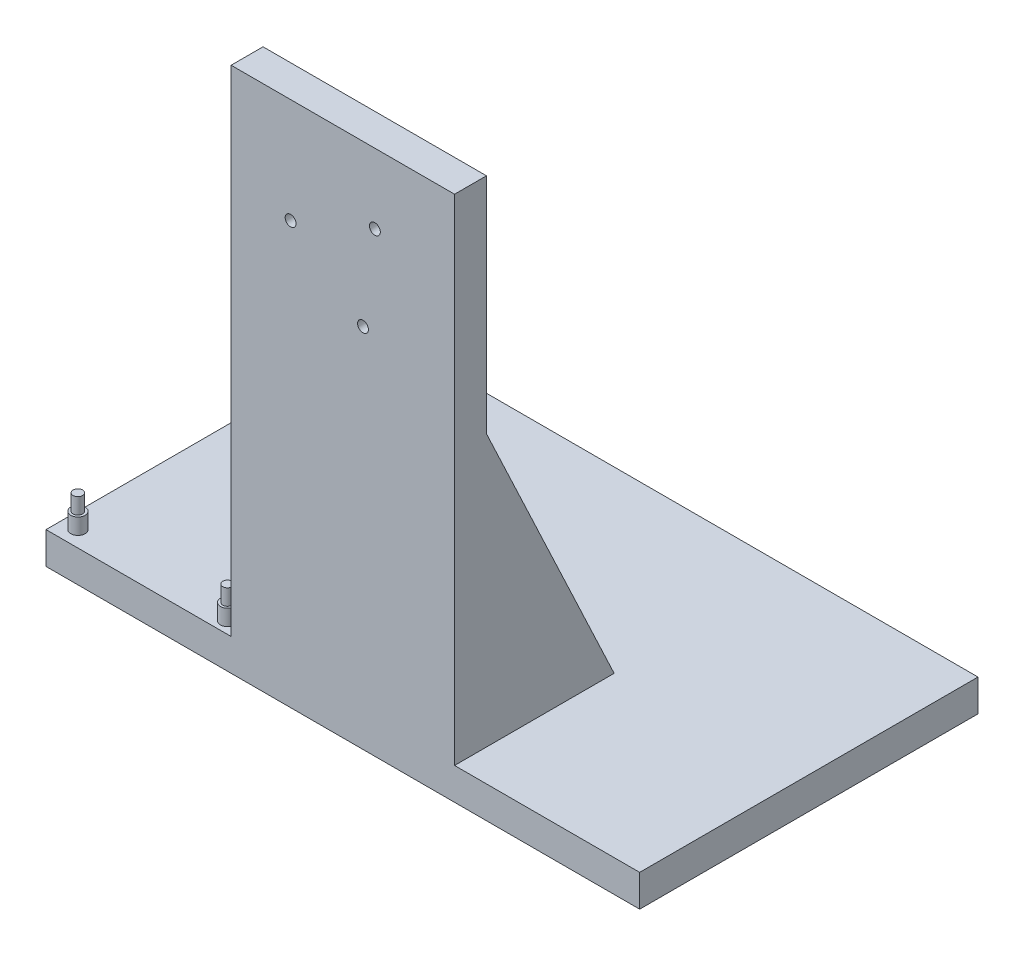
ISO-10303-21;
HEADER;
FILE_DESCRIPTION(('STEP AP214'),'2;1');
FILE_NAME('part.step','',(''),(''),'','','');
FILE_SCHEMA(('AUTOMOTIVE_DESIGN { 1 0 10303 214 1 1 1 1 }'));
ENDSEC;
DATA;
#1=APPLICATION_CONTEXT('core data for automotive mechanical design processes');
#2=APPLICATION_PROTOCOL_DEFINITION('international standard','automotive_design',2000,#1);
#3=PRODUCT_CONTEXT('',#1,'mechanical');
#4=PRODUCT('Part','Part','',(#3));
#5=PRODUCT_RELATED_PRODUCT_CATEGORY('part','',(#4));
#6=PRODUCT_DEFINITION_FORMATION('','',#4);
#7=PRODUCT_DEFINITION_CONTEXT('part definition',#1,'design');
#8=PRODUCT_DEFINITION('design','',#6,#7);
#9=PRODUCT_DEFINITION_SHAPE('','',#8);
#10=(LENGTH_UNIT() NAMED_UNIT(*) SI_UNIT(.MILLI.,.METRE.));
#11=(NAMED_UNIT(*) PLANE_ANGLE_UNIT() SI_UNIT($,.RADIAN.));
#12=(NAMED_UNIT(*) SI_UNIT($,.STERADIAN.) SOLID_ANGLE_UNIT());
#13=UNCERTAINTY_MEASURE_WITH_UNIT(LENGTH_MEASURE(1.E-05),#10,'distance_accuracy_value','');
#14=(GEOMETRIC_REPRESENTATION_CONTEXT(3) GLOBAL_UNCERTAINTY_ASSIGNED_CONTEXT((#13)) GLOBAL_UNIT_ASSIGNED_CONTEXT((#10,
#11,#12)) REPRESENTATION_CONTEXT('',''));
#15=CARTESIAN_POINT('',(0.,0.,0.));
#16=DIRECTION('',(0.,0.,1.));
#17=DIRECTION('',(1.,0.,0.));
#18=AXIS2_PLACEMENT_3D('',#15,#16,#17);
#19=CARTESIAN_POINT('',(35.,-35.,10.));
#20=DIRECTION('',(-1.,0.,0.));
#21=DIRECTION('',(0.,0.,1.));
#22=AXIS2_PLACEMENT_3D('',#19,#20,#21);
#23=PLANE('',#22);
#24=DIRECTION('',(0.,0.,1.));
#25=VECTOR('',#24,1.);
#26=CARTESIAN_POINT('',(35.,-120.,10.));
#27=LINE('',#26,#25);
#28=CARTESIAN_POINT('',(35.,-120.,-39.9999999999999));
#29=VERTEX_POINT('',#28);
#30=CARTESIAN_POINT('',(35.,-120.,10.));
#31=VERTEX_POINT('',#30);
#32=EDGE_CURVE('E67',#29,#31,#27,.T.);
#33=ORIENTED_EDGE('',*,*,#32,.F.);
#34=DIRECTION('',(0.,0.904818702200993,0.425797036329882));
#35=VECTOR('',#34,1.);
#36=CARTESIAN_POINT('',(35.,-31.1473087818698,1.81303116147334));
#37=LINE('',#36,#35);
#38=CARTESIAN_POINT('',(35.,-35.0000000000006,0.));
#39=VERTEX_POINT('',#38);
#40=EDGE_CURVE('E234',#29,#39,#37,.T.);
#41=ORIENTED_EDGE('',*,*,#40,.T.);
#42=DIRECTION('',(0.,1.,0.));
#43=VECTOR('',#42,1.);
#44=CARTESIAN_POINT('',(35.,-35.,0.));
#45=LINE('',#44,#43);
#46=CARTESIAN_POINT('',(35.,35.,0.));
#47=VERTEX_POINT('',#46);
#48=EDGE_CURVE('E207',#39,#47,#45,.T.);
#49=ORIENTED_EDGE('',*,*,#48,.T.);
#50=DIRECTION('',(0.,0.,-1.));
#51=VECTOR('',#50,1.);
#52=CARTESIAN_POINT('',(35.,35.,10.));
#53=LINE('',#52,#51);
#54=CARTESIAN_POINT('',(35.,35.,10.));
#55=VERTEX_POINT('',#54);
#56=EDGE_CURVE('E224',#55,#47,#53,.T.);
#57=ORIENTED_EDGE('',*,*,#56,.F.);
#58=DIRECTION('',(0.,1.,0.));
#59=VECTOR('',#58,1.);
#60=CARTESIAN_POINT('',(35.,-35.,10.));
#61=LINE('',#60,#59);
#62=EDGE_CURVE('E208',#31,#55,#61,.T.);
#63=ORIENTED_EDGE('',*,*,#62,.F.);
#64=EDGE_LOOP('',(#33,#41,#49,#57,#63));
#65=FACE_BOUND('',#64,.T.);
#66=ADVANCED_FACE('F41',(#65),#23,.F.);
#67=CARTESIAN_POINT('',(-35.,-35.,10.));
#68=DIRECTION('',(1.,0.,0.));
#69=DIRECTION('',(0.,0.,-1.));
#70=AXIS2_PLACEMENT_3D('',#67,#68,#69);
#71=PLANE('',#70);
#72=DIRECTION('',(0.,0.,-1.));
#73=VECTOR('',#72,1.);
#74=CARTESIAN_POINT('',(-35.,-120.,10.));
#75=LINE('',#74,#73);
#76=CARTESIAN_POINT('',(-35.,-120.,10.));
#77=VERTEX_POINT('',#76);
#78=CARTESIAN_POINT('',(-35.,-120.,-39.9999999999999));
#79=VERTEX_POINT('',#78);
#80=EDGE_CURVE('E59',#77,#79,#75,.T.);
#81=ORIENTED_EDGE('',*,*,#80,.F.);
#82=DIRECTION('',(0.,-1.,0.));
#83=VECTOR('',#82,1.);
#84=CARTESIAN_POINT('',(-35.,-35.,10.));
#85=LINE('',#84,#83);
#86=CARTESIAN_POINT('',(-35.,35.,10.));
#87=VERTEX_POINT('',#86);
#88=EDGE_CURVE('E213',#87,#77,#85,.T.);
#89=ORIENTED_EDGE('',*,*,#88,.F.);
#90=DIRECTION('',(0.,0.,-1.));
#91=VECTOR('',#90,1.);
#92=CARTESIAN_POINT('',(-35.,35.,10.));
#93=LINE('',#92,#91);
#94=CARTESIAN_POINT('',(-35.,35.,0.));
#95=VERTEX_POINT('',#94);
#96=EDGE_CURVE('E216',#87,#95,#93,.T.);
#97=ORIENTED_EDGE('',*,*,#96,.T.);
#98=DIRECTION('',(0.,-1.,0.));
#99=VECTOR('',#98,1.);
#100=CARTESIAN_POINT('',(-35.,-35.,0.));
#101=LINE('',#100,#99);
#102=CARTESIAN_POINT('',(-35.,-35.0000000000006,0.));
#103=VERTEX_POINT('',#102);
#104=EDGE_CURVE('E211',#95,#103,#101,.T.);
#105=ORIENTED_EDGE('',*,*,#104,.T.);
#106=DIRECTION('',(0.,-0.904818702200993,-0.425797036329882));
#107=VECTOR('',#106,1.);
#108=CARTESIAN_POINT('',(-35.,-31.1473087818698,1.81303116147334));
#109=LINE('',#108,#107);
#110=EDGE_CURVE('E232',#103,#79,#109,.T.);
#111=ORIENTED_EDGE('',*,*,#110,.T.);
#112=EDGE_LOOP('',(#81,#89,#97,#105,#111));
#113=FACE_BOUND('',#112,.T.);
#114=ADVANCED_FACE('F304',(#113),#71,.F.);
#115=CARTESIAN_POINT('',(0.,0.,0.));
#116=DIRECTION('',(0.,0.,-1.));
#117=DIRECTION('',(-1.,0.,0.));
#118=AXIS2_PLACEMENT_3D('',#115,#116,#117);
#119=PLANE('',#118);
#120=CARTESIAN_POINT('',(6.31427663402399,-15.2440122864362,0.));
#121=DIRECTION('',(0.,0.,-1.));
#122=DIRECTION('',(-1.,0.,0.));
#123=AXIS2_PLACEMENT_3D('',#120,#121,#122);
#124=CIRCLE('',#123,3.275);
#125=CARTESIAN_POINT('',(3.03927663402399,-15.2440122864362,0.));
#126=VERTEX_POINT('',#125);
#127=EDGE_CURVE('E162',#126,#126,#124,.T.);
#128=ORIENTED_EDGE('',*,*,#127,.F.);
#129=EDGE_LOOP('',(#128));
#130=FACE_BOUND('',#129,.T.);
#131=CARTESIAN_POINT('',(10.0445635786439,13.0903301148054,0.));
#132=DIRECTION('',(0.,0.,-1.));
#133=DIRECTION('',(-1.,0.,0.));
#134=AXIS2_PLACEMENT_3D('',#131,#132,#133);
#135=CIRCLE('',#134,3.275);
#136=CARTESIAN_POINT('',(6.76956357864391,13.0903301148054,0.));
#137=VERTEX_POINT('',#136);
#138=EDGE_CURVE('E177',#137,#137,#135,.T.);
#139=ORIENTED_EDGE('',*,*,#138,.F.);
#140=EDGE_LOOP('',(#139));
#141=FACE_BOUND('',#140,.T.);
#142=CARTESIAN_POINT('',(-16.3588402126679,2.1536821716308,0.));
#143=DIRECTION('',(0.,0.,-1.));
#144=DIRECTION('',(-1.,0.,0.));
#145=AXIS2_PLACEMENT_3D('',#142,#143,#144);
#146=CIRCLE('',#145,3.275);
#147=CARTESIAN_POINT('',(-19.6338402126679,2.1536821716308,0.));
#148=VERTEX_POINT('',#147);
#149=EDGE_CURVE('E192',#148,#148,#146,.T.);
#150=ORIENTED_EDGE('',*,*,#149,.F.);
#151=EDGE_LOOP('',(#150));
#152=FACE_BOUND('',#151,.T.);
#153=ORIENTED_EDGE('',*,*,#48,.F.);
#154=DIRECTION('',(-1.,0.,0.));
#155=VECTOR('',#154,1.);
#156=CARTESIAN_POINT('',(0.,-35.0000000000006,0.));
#157=LINE('',#156,#155);
#158=EDGE_CURVE('E227',#39,#103,#157,.T.);
#159=ORIENTED_EDGE('',*,*,#158,.T.);
#160=ORIENTED_EDGE('',*,*,#104,.F.);
#161=DIRECTION('',(-1.,0.,0.));
#162=VECTOR('',#161,1.);
#163=CARTESIAN_POINT('',(-35.,35.,0.));
#164=LINE('',#163,#162);
#165=EDGE_CURVE('E218',#47,#95,#164,.T.);
#166=ORIENTED_EDGE('',*,*,#165,.F.);
#167=EDGE_LOOP('',(#153,#159,#160,#166));
#168=FACE_BOUND('',#167,.T.);
#169=ADVANCED_FACE('F309',(#130,#141,#152,#168),#119,.T.);
#170=CARTESIAN_POINT('',(-35.,35.,10.));
#171=DIRECTION('',(0.,-1.,0.));
#172=DIRECTION('',(0.,0.,-1.));
#173=AXIS2_PLACEMENT_3D('',#170,#171,#172);
#174=PLANE('',#173);
#175=ORIENTED_EDGE('',*,*,#165,.T.);
#176=ORIENTED_EDGE('',*,*,#96,.F.);
#177=DIRECTION('',(-1.,0.,0.));
#178=VECTOR('',#177,1.);
#179=CARTESIAN_POINT('',(-35.,35.,10.));
#180=LINE('',#179,#178);
#181=EDGE_CURVE('E210',#55,#87,#180,.T.);
#182=ORIENTED_EDGE('',*,*,#181,.F.);
#183=ORIENTED_EDGE('',*,*,#56,.T.);
#184=EDGE_LOOP('',(#175,#176,#182,#183));
#185=FACE_BOUND('',#184,.T.);
#186=ADVANCED_FACE('F313',(#185),#174,.F.);
#187=CARTESIAN_POINT('',(0.,0.,10.));
#188=DIRECTION('',(0.,0.,-1.));
#189=DIRECTION('',(-1.,0.,0.));
#190=AXIS2_PLACEMENT_3D('',#187,#188,#189);
#191=PLANE('',#190);
#192=DIRECTION('',(-1.,0.,0.));
#193=VECTOR('',#192,1.);
#194=CARTESIAN_POINT('',(-35.,-130.,10.));
#195=LINE('',#194,#193);
#196=CARTESIAN_POINT('',(93.,-130.,10.));
#197=VERTEX_POINT('',#196);
#198=CARTESIAN_POINT('',(-93.,-130.,10.));
#199=VERTEX_POINT('',#198);
#200=EDGE_CURVE('E160',#197,#199,#195,.T.);
#201=ORIENTED_EDGE('',*,*,#200,.F.);
#202=DIRECTION('',(0.,-1.,0.));
#203=VECTOR('',#202,1.);
#204=CARTESIAN_POINT('',(93.,-120.,10.));
#205=LINE('',#204,#203);
#206=CARTESIAN_POINT('',(93.,-120.,10.));
#207=VERTEX_POINT('',#206);
#208=EDGE_CURVE('E154',#207,#197,#205,.T.);
#209=ORIENTED_EDGE('',*,*,#208,.F.);
#210=DIRECTION('',(1.,0.,0.));
#211=VECTOR('',#210,1.);
#212=CARTESIAN_POINT('',(-93.,-120.,10.));
#213=LINE('',#212,#211);
#214=EDGE_CURVE('E148',#31,#207,#213,.T.);
#215=ORIENTED_EDGE('',*,*,#214,.F.);
#216=ORIENTED_EDGE('',*,*,#62,.T.);
#217=ORIENTED_EDGE('',*,*,#181,.T.);
#218=ORIENTED_EDGE('',*,*,#88,.T.);
#219=CARTESIAN_POINT('',(-93.,-120.,10.));
#220=VERTEX_POINT('',#219);
#221=EDGE_CURVE('E126',#220,#77,#213,.T.);
#222=ORIENTED_EDGE('',*,*,#221,.F.);
#223=DIRECTION('',(0.,-1.,0.));
#224=VECTOR('',#223,1.);
#225=CARTESIAN_POINT('',(-93.,-120.,10.));
#226=LINE('',#225,#224);
#227=EDGE_CURVE('E137',#220,#199,#226,.T.);
#228=ORIENTED_EDGE('',*,*,#227,.T.);
#229=EDGE_LOOP('',(#201,#209,#215,#216,#217,#218,#222,#228));
#230=FACE_BOUND('',#229,.T.);
#231=CARTESIAN_POINT('',(-16.3588402126679,2.1536821716308,10.));
#232=DIRECTION('',(0.,0.,-1.));
#233=DIRECTION('',(-1.,0.,0.));
#234=AXIS2_PLACEMENT_3D('',#231,#232,#233);
#235=CIRCLE('',#234,1.7);
#236=CARTESIAN_POINT('',(-18.0588402126679,2.1536821716308,10.));
#237=VERTEX_POINT('',#236);
#238=EDGE_CURVE('E204',#237,#237,#235,.T.);
#239=ORIENTED_EDGE('',*,*,#238,.T.);
#240=EDGE_LOOP('',(#239));
#241=FACE_BOUND('',#240,.T.);
#242=CARTESIAN_POINT('',(10.0445635786439,13.0903301148054,10.));
#243=DIRECTION('',(0.,0.,-1.));
#244=DIRECTION('',(-1.,0.,0.));
#245=AXIS2_PLACEMENT_3D('',#242,#243,#244);
#246=CIRCLE('',#245,1.7);
#247=CARTESIAN_POINT('',(8.34456357864391,13.0903301148054,10.));
#248=VERTEX_POINT('',#247);
#249=EDGE_CURVE('E189',#248,#248,#246,.T.);
#250=ORIENTED_EDGE('',*,*,#249,.T.);
#251=EDGE_LOOP('',(#250));
#252=FACE_BOUND('',#251,.T.);
#253=CARTESIAN_POINT('',(6.31427663402399,-15.2440122864362,10.));
#254=DIRECTION('',(0.,0.,-1.));
#255=DIRECTION('',(-1.,0.,0.));
#256=AXIS2_PLACEMENT_3D('',#253,#254,#255);
#257=CIRCLE('',#256,1.7);
#258=CARTESIAN_POINT('',(4.61427663402399,-15.2440122864362,10.));
#259=VERTEX_POINT('',#258);
#260=EDGE_CURVE('E174',#259,#259,#257,.T.);
#261=ORIENTED_EDGE('',*,*,#260,.T.);
#262=EDGE_LOOP('',(#261));
#263=FACE_BOUND('',#262,.T.);
#264=ADVANCED_FACE('F315',(#230,#241,#252,#263),#191,.F.);
#265=CARTESIAN_POINT('',(-16.3588402126679,2.1536821716308,0.));
#266=DIRECTION('',(0.,0.,-1.));
#267=DIRECTION('',(-1.,0.,0.));
#268=AXIS2_PLACEMENT_3D('',#265,#266,#267);
#269=CYLINDRICAL_SURFACE('',#268,1.7);
#270=ORIENTED_EDGE('',*,*,#238,.F.);
#271=EDGE_LOOP('',(#270));
#272=FACE_BOUND('',#271,.T.);
#273=CARTESIAN_POINT('',(-16.3588402126679,2.1536821716308,3.));
#274=DIRECTION('',(0.,0.,-1.));
#275=DIRECTION('',(-1.,0.,0.));
#276=AXIS2_PLACEMENT_3D('',#273,#274,#275);
#277=CIRCLE('',#276,1.7);
#278=CARTESIAN_POINT('',(-18.0588402126679,2.1536821716308,3.));
#279=VERTEX_POINT('',#278);
#280=EDGE_CURVE('E201',#279,#279,#277,.T.);
#281=ORIENTED_EDGE('',*,*,#280,.T.);
#282=EDGE_LOOP('',(#281));
#283=FACE_BOUND('',#282,.T.);
#284=ADVANCED_FACE('F323',(#272,#283),#269,.F.);
#285=CARTESIAN_POINT('',(-13.1088402126679,2.1536821716308,3.));
#286=DIRECTION('',(0.,0.,1.));
#287=DIRECTION('',(1.,0.,0.));
#288=AXIS2_PLACEMENT_3D('',#285,#286,#287);
#289=PLANE('',#288);
#290=ORIENTED_EDGE('',*,*,#280,.F.);
#291=EDGE_LOOP('',(#290));
#292=FACE_BOUND('',#291,.T.);
#293=CARTESIAN_POINT('',(-16.3588402126679,2.1536821716308,3.));
#294=DIRECTION('',(0.,0.,-1.));
#295=DIRECTION('',(-1.,0.,0.));
#296=AXIS2_PLACEMENT_3D('',#293,#294,#295);
#297=CIRCLE('',#296,3.25);
#298=CARTESIAN_POINT('',(-19.6088402126679,2.1536821716308,3.));
#299=VERTEX_POINT('',#298);
#300=EDGE_CURVE('E198',#299,#299,#297,.T.);
#301=ORIENTED_EDGE('',*,*,#300,.T.);
#302=EDGE_LOOP('',(#301));
#303=FACE_BOUND('',#302,.T.);
#304=ADVANCED_FACE('F327',(#292,#303),#289,.F.);
#305=CARTESIAN_POINT('',(-16.3588402126679,2.1536821716308,0.));
#306=DIRECTION('',(0.,0.,-1.));
#307=DIRECTION('',(-1.,0.,0.));
#308=AXIS2_PLACEMENT_3D('',#305,#306,#307);
#309=CYLINDRICAL_SURFACE('',#308,3.25);
#310=ORIENTED_EDGE('',*,*,#300,.F.);
#311=EDGE_LOOP('',(#310));
#312=FACE_BOUND('',#311,.T.);
#313=CARTESIAN_POINT('',(-16.3588402126679,2.1536821716308,0.0250000000000001));
#314=DIRECTION('',(0.,0.,-1.));
#315=DIRECTION('',(-1.,0.,0.));
#316=AXIS2_PLACEMENT_3D('',#313,#314,#315);
#317=CIRCLE('',#316,3.25);
#318=CARTESIAN_POINT('',(-19.6088402126679,2.1536821716308,0.0250000000000001));
#319=VERTEX_POINT('',#318);
#320=EDGE_CURVE('E195',#319,#319,#317,.T.);
#321=ORIENTED_EDGE('',*,*,#320,.T.);
#322=EDGE_LOOP('',(#321));
#323=FACE_BOUND('',#322,.T.);
#324=ADVANCED_FACE('F331',(#312,#323),#309,.F.);
#325=CARTESIAN_POINT('',(-16.3588402126679,2.1536821716308,0.));
#326=DIRECTION('',(0.,0.,-1.));
#327=DIRECTION('',(-1.,0.,0.));
#328=AXIS2_PLACEMENT_3D('',#325,#326,#327);
#329=CONICAL_SURFACE('',#328,3.275,0.785398163397461);
#330=ORIENTED_EDGE('',*,*,#320,.F.);
#331=EDGE_LOOP('',(#330));
#332=FACE_BOUND('',#331,.T.);
#333=ORIENTED_EDGE('',*,*,#149,.T.);
#334=EDGE_LOOP('',(#333));
#335=FACE_BOUND('',#334,.T.);
#336=ADVANCED_FACE('F335',(#332,#335),#329,.F.);
#337=CARTESIAN_POINT('',(10.0445635786439,13.0903301148054,0.));
#338=DIRECTION('',(0.,0.,-1.));
#339=DIRECTION('',(-1.,0.,0.));
#340=AXIS2_PLACEMENT_3D('',#337,#338,#339);
#341=CYLINDRICAL_SURFACE('',#340,1.7);
#342=ORIENTED_EDGE('',*,*,#249,.F.);
#343=EDGE_LOOP('',(#342));
#344=FACE_BOUND('',#343,.T.);
#345=CARTESIAN_POINT('',(10.0445635786439,13.0903301148054,3.));
#346=DIRECTION('',(0.,0.,-1.));
#347=DIRECTION('',(-1.,0.,0.));
#348=AXIS2_PLACEMENT_3D('',#345,#346,#347);
#349=CIRCLE('',#348,1.7);
#350=CARTESIAN_POINT('',(8.34456357864391,13.0903301148054,3.));
#351=VERTEX_POINT('',#350);
#352=EDGE_CURVE('E186',#351,#351,#349,.T.);
#353=ORIENTED_EDGE('',*,*,#352,.T.);
#354=EDGE_LOOP('',(#353));
#355=FACE_BOUND('',#354,.T.);
#356=ADVANCED_FACE('F339',(#344,#355),#341,.F.);
#357=CARTESIAN_POINT('',(13.2945635786439,13.0903301148054,3.));
#358=DIRECTION('',(0.,0.,1.));
#359=DIRECTION('',(1.,0.,0.));
#360=AXIS2_PLACEMENT_3D('',#357,#358,#359);
#361=PLANE('',#360);
#362=ORIENTED_EDGE('',*,*,#352,.F.);
#363=EDGE_LOOP('',(#362));
#364=FACE_BOUND('',#363,.T.);
#365=CARTESIAN_POINT('',(10.0445635786439,13.0903301148054,3.));
#366=DIRECTION('',(0.,0.,-1.));
#367=DIRECTION('',(-1.,0.,0.));
#368=AXIS2_PLACEMENT_3D('',#365,#366,#367);
#369=CIRCLE('',#368,3.25);
#370=CARTESIAN_POINT('',(6.79456357864391,13.0903301148054,3.));
#371=VERTEX_POINT('',#370);
#372=EDGE_CURVE('E183',#371,#371,#369,.T.);
#373=ORIENTED_EDGE('',*,*,#372,.T.);
#374=EDGE_LOOP('',(#373));
#375=FACE_BOUND('',#374,.T.);
#376=ADVANCED_FACE('F343',(#364,#375),#361,.F.);
#377=CARTESIAN_POINT('',(10.0445635786439,13.0903301148054,0.));
#378=DIRECTION('',(0.,0.,-1.));
#379=DIRECTION('',(-1.,0.,0.));
#380=AXIS2_PLACEMENT_3D('',#377,#378,#379);
#381=CYLINDRICAL_SURFACE('',#380,3.25);
#382=ORIENTED_EDGE('',*,*,#372,.F.);
#383=EDGE_LOOP('',(#382));
#384=FACE_BOUND('',#383,.T.);
#385=CARTESIAN_POINT('',(10.0445635786439,13.0903301148054,0.0250000000000001));
#386=DIRECTION('',(0.,0.,-1.));
#387=DIRECTION('',(-1.,0.,0.));
#388=AXIS2_PLACEMENT_3D('',#385,#386,#387);
#389=CIRCLE('',#388,3.25);
#390=CARTESIAN_POINT('',(6.79456357864391,13.0903301148054,0.0250000000000001));
#391=VERTEX_POINT('',#390);
#392=EDGE_CURVE('E180',#391,#391,#389,.T.);
#393=ORIENTED_EDGE('',*,*,#392,.T.);
#394=EDGE_LOOP('',(#393));
#395=FACE_BOUND('',#394,.T.);
#396=ADVANCED_FACE('F347',(#384,#395),#381,.F.);
#397=CARTESIAN_POINT('',(10.0445635786439,13.0903301148054,0.));
#398=DIRECTION('',(0.,0.,-1.));
#399=DIRECTION('',(-1.,0.,0.));
#400=AXIS2_PLACEMENT_3D('',#397,#398,#399);
#401=CONICAL_SURFACE('',#400,3.275,0.785398163397461);
#402=ORIENTED_EDGE('',*,*,#392,.F.);
#403=EDGE_LOOP('',(#402));
#404=FACE_BOUND('',#403,.T.);
#405=ORIENTED_EDGE('',*,*,#138,.T.);
#406=EDGE_LOOP('',(#405));
#407=FACE_BOUND('',#406,.T.);
#408=ADVANCED_FACE('F351',(#404,#407),#401,.F.);
#409=CARTESIAN_POINT('',(6.31427663402399,-15.2440122864362,0.));
#410=DIRECTION('',(0.,0.,-1.));
#411=DIRECTION('',(-1.,0.,0.));
#412=AXIS2_PLACEMENT_3D('',#409,#410,#411);
#413=CYLINDRICAL_SURFACE('',#412,1.7);
#414=ORIENTED_EDGE('',*,*,#260,.F.);
#415=EDGE_LOOP('',(#414));
#416=FACE_BOUND('',#415,.T.);
#417=CARTESIAN_POINT('',(6.31427663402399,-15.2440122864362,3.));
#418=DIRECTION('',(0.,0.,-1.));
#419=DIRECTION('',(-1.,0.,0.));
#420=AXIS2_PLACEMENT_3D('',#417,#418,#419);
#421=CIRCLE('',#420,1.7);
#422=CARTESIAN_POINT('',(4.61427663402399,-15.2440122864362,3.));
#423=VERTEX_POINT('',#422);
#424=EDGE_CURVE('E171',#423,#423,#421,.T.);
#425=ORIENTED_EDGE('',*,*,#424,.T.);
#426=EDGE_LOOP('',(#425));
#427=FACE_BOUND('',#426,.T.);
#428=ADVANCED_FACE('F355',(#416,#427),#413,.F.);
#429=CARTESIAN_POINT('',(9.56427663402399,-15.2440122864362,3.));
#430=DIRECTION('',(0.,0.,1.));
#431=DIRECTION('',(1.,0.,0.));
#432=AXIS2_PLACEMENT_3D('',#429,#430,#431);
#433=PLANE('',#432);
#434=ORIENTED_EDGE('',*,*,#424,.F.);
#435=EDGE_LOOP('',(#434));
#436=FACE_BOUND('',#435,.T.);
#437=CARTESIAN_POINT('',(6.31427663402399,-15.2440122864362,3.));
#438=DIRECTION('',(0.,0.,-1.));
#439=DIRECTION('',(-1.,0.,0.));
#440=AXIS2_PLACEMENT_3D('',#437,#438,#439);
#441=CIRCLE('',#440,3.25);
#442=CARTESIAN_POINT('',(3.06427663402399,-15.2440122864362,3.));
#443=VERTEX_POINT('',#442);
#444=EDGE_CURVE('E168',#443,#443,#441,.T.);
#445=ORIENTED_EDGE('',*,*,#444,.T.);
#446=EDGE_LOOP('',(#445));
#447=FACE_BOUND('',#446,.T.);
#448=ADVANCED_FACE('F359',(#436,#447),#433,.F.);
#449=CARTESIAN_POINT('',(6.31427663402399,-15.2440122864362,0.));
#450=DIRECTION('',(0.,0.,-1.));
#451=DIRECTION('',(-1.,0.,0.));
#452=AXIS2_PLACEMENT_3D('',#449,#450,#451);
#453=CYLINDRICAL_SURFACE('',#452,3.25);
#454=ORIENTED_EDGE('',*,*,#444,.F.);
#455=EDGE_LOOP('',(#454));
#456=FACE_BOUND('',#455,.T.);
#457=CARTESIAN_POINT('',(6.31427663402399,-15.2440122864362,0.0250000000000001));
#458=DIRECTION('',(0.,0.,-1.));
#459=DIRECTION('',(-1.,0.,0.));
#460=AXIS2_PLACEMENT_3D('',#457,#458,#459);
#461=CIRCLE('',#460,3.25);
#462=CARTESIAN_POINT('',(3.06427663402399,-15.2440122864362,0.0250000000000001));
#463=VERTEX_POINT('',#462);
#464=EDGE_CURVE('E165',#463,#463,#461,.T.);
#465=ORIENTED_EDGE('',*,*,#464,.T.);
#466=EDGE_LOOP('',(#465));
#467=FACE_BOUND('',#466,.T.);
#468=ADVANCED_FACE('F363',(#456,#467),#453,.F.);
#469=CARTESIAN_POINT('',(6.31427663402399,-15.2440122864362,0.));
#470=DIRECTION('',(0.,0.,-1.));
#471=DIRECTION('',(-1.,0.,0.));
#472=AXIS2_PLACEMENT_3D('',#469,#470,#471);
#473=CONICAL_SURFACE('',#472,3.275,0.785398163397461);
#474=ORIENTED_EDGE('',*,*,#464,.F.);
#475=EDGE_LOOP('',(#474));
#476=FACE_BOUND('',#475,.T.);
#477=ORIENTED_EDGE('',*,*,#127,.T.);
#478=EDGE_LOOP('',(#477));
#479=FACE_BOUND('',#478,.T.);
#480=ADVANCED_FACE('F298',(#476,#479),#473,.F.);
#481=CARTESIAN_POINT('',(0.,-130.,0.));
#482=DIRECTION('',(0.,-1.,0.));
#483=DIRECTION('',(0.,0.,-1.));
#484=AXIS2_PLACEMENT_3D('',#481,#482,#483);
#485=PLANE('',#484);
#486=DIRECTION('',(0.,0.,-1.));
#487=VECTOR('',#486,1.);
#488=CARTESIAN_POINT('',(93.,-130.,10.));
#489=LINE('',#488,#487);
#490=CARTESIAN_POINT('',(93.,-130.,-96.));
#491=VERTEX_POINT('',#490);
#492=EDGE_CURVE('E139',#197,#491,#489,.T.);
#493=ORIENTED_EDGE('',*,*,#492,.F.);
#494=ORIENTED_EDGE('',*,*,#200,.T.);
#495=DIRECTION('',(0.,0.,-1.));
#496=VECTOR('',#495,1.);
#497=CARTESIAN_POINT('',(-93.,-130.,10.));
#498=LINE('',#497,#496);
#499=CARTESIAN_POINT('',(-93.,-130.,-96.));
#500=VERTEX_POINT('',#499);
#501=EDGE_CURVE('E150',#199,#500,#498,.T.);
#502=ORIENTED_EDGE('',*,*,#501,.T.);
#503=DIRECTION('',(1.,0.,0.));
#504=VECTOR('',#503,1.);
#505=CARTESIAN_POINT('',(-93.,-130.,-96.));
#506=LINE('',#505,#504);
#507=EDGE_CURVE('E120',#500,#491,#506,.T.);
#508=ORIENTED_EDGE('',*,*,#507,.T.);
#509=EDGE_LOOP('',(#493,#494,#502,#508));
#510=FACE_BOUND('',#509,.T.);
#511=ADVANCED_FACE('F288',(#510),#485,.T.);
#512=CARTESIAN_POINT('',(0.,-120.,0.));
#513=DIRECTION('',(0.,-1.,0.));
#514=DIRECTION('',(0.,0.,-1.));
#515=AXIS2_PLACEMENT_3D('',#512,#513,#514);
#516=PLANE('',#515);
#517=CARTESIAN_POINT('',(-39.8,-120.,6.29999999999999));
#518=DIRECTION('',(0.,-1.,0.));
#519=DIRECTION('',(0.,0.,-1.));
#520=AXIS2_PLACEMENT_3D('',#517,#518,#519);
#521=CIRCLE('',#520,2.25);
#522=CARTESIAN_POINT('',(-39.8,-120.,4.04999999999998));
#523=VERTEX_POINT('',#522);
#524=EDGE_CURVE('E46',#523,#523,#521,.F.);
#525=ORIENTED_EDGE('',*,*,#524,.F.);
#526=EDGE_LOOP('',(#525));
#527=FACE_BOUND('',#526,.T.);
#528=CARTESIAN_POINT('',(-88.,-120.,4.99999999999999));
#529=DIRECTION('',(0.,-1.,0.));
#530=DIRECTION('',(0.,0.,-1.));
#531=AXIS2_PLACEMENT_3D('',#528,#529,#530);
#532=CIRCLE('',#531,2.25);
#533=CARTESIAN_POINT('',(-88.,-120.,2.74999999999999));
#534=VERTEX_POINT('',#533);
#535=EDGE_CURVE('E244',#534,#534,#532,.F.);
#536=ORIENTED_EDGE('',*,*,#535,.F.);
#537=EDGE_LOOP('',(#536));
#538=FACE_BOUND('',#537,.T.);
#539=CARTESIAN_POINT('',(-72.8,-120.,-45.8));
#540=DIRECTION('',(0.,-1.,0.));
#541=DIRECTION('',(0.,0.,-1.));
#542=AXIS2_PLACEMENT_3D('',#539,#540,#541);
#543=CIRCLE('',#542,2.25);
#544=CARTESIAN_POINT('',(-72.8,-120.,-48.05));
#545=VERTEX_POINT('',#544);
#546=EDGE_CURVE('E242',#545,#545,#543,.F.);
#547=ORIENTED_EDGE('',*,*,#546,.F.);
#548=EDGE_LOOP('',(#547));
#549=FACE_BOUND('',#548,.T.);
#550=CARTESIAN_POINT('',(-44.9,-120.,-45.8));
#551=DIRECTION('',(0.,-1.,0.));
#552=DIRECTION('',(0.,0.,-1.));
#553=AXIS2_PLACEMENT_3D('',#550,#551,#552);
#554=CIRCLE('',#553,2.25);
#555=CARTESIAN_POINT('',(-44.9,-120.,-48.05));
#556=VERTEX_POINT('',#555);
#557=EDGE_CURVE('E239',#556,#556,#554,.F.);
#558=ORIENTED_EDGE('',*,*,#557,.F.);
#559=EDGE_LOOP('',(#558));
#560=FACE_BOUND('',#559,.T.);
#561=CARTESIAN_POINT('',(-88.,-120.,-69.9));
#562=DIRECTION('',(0.,-1.,0.));
#563=DIRECTION('',(0.,0.,-1.));
#564=AXIS2_PLACEMENT_3D('',#561,#562,#563);
#565=CIRCLE('',#564,2.25);
#566=CARTESIAN_POINT('',(-88.,-120.,-72.15));
#567=VERTEX_POINT('',#566);
#568=EDGE_CURVE('E236',#567,#567,#565,.F.);
#569=ORIENTED_EDGE('',*,*,#568,.F.);
#570=EDGE_LOOP('',(#569));
#571=FACE_BOUND('',#570,.T.);
#572=ORIENTED_EDGE('',*,*,#80,.T.);
#573=DIRECTION('',(1.,0.,0.));
#574=VECTOR('',#573,1.);
#575=CARTESIAN_POINT('',(0.,-120.,-39.9999999999999));
#576=LINE('',#575,#574);
#577=EDGE_CURVE('E230',#79,#29,#576,.T.);
#578=ORIENTED_EDGE('',*,*,#577,.T.);
#579=ORIENTED_EDGE('',*,*,#32,.T.);
#580=ORIENTED_EDGE('',*,*,#214,.T.);
#581=DIRECTION('',(0.,0.,-1.));
#582=VECTOR('',#581,1.);
#583=CARTESIAN_POINT('',(93.,-120.,10.));
#584=LINE('',#583,#582);
#585=CARTESIAN_POINT('',(93.,-120.,-96.));
#586=VERTEX_POINT('',#585);
#587=EDGE_CURVE('E132',#207,#586,#584,.T.);
#588=ORIENTED_EDGE('',*,*,#587,.T.);
#589=DIRECTION('',(1.,0.,0.));
#590=VECTOR('',#589,1.);
#591=CARTESIAN_POINT('',(-93.,-120.,-96.));
#592=LINE('',#591,#590);
#593=CARTESIAN_POINT('',(-93.,-120.,-96.));
#594=VERTEX_POINT('',#593);
#595=EDGE_CURVE('E118',#594,#586,#592,.T.);
#596=ORIENTED_EDGE('',*,*,#595,.F.);
#597=DIRECTION('',(0.,0.,-1.));
#598=VECTOR('',#597,1.);
#599=CARTESIAN_POINT('',(-93.,-120.,10.));
#600=LINE('',#599,#598);
#601=EDGE_CURVE('E130',#220,#594,#600,.T.);
#602=ORIENTED_EDGE('',*,*,#601,.F.);
#603=ORIENTED_EDGE('',*,*,#221,.T.);
#604=EDGE_LOOP('',(#572,#578,#579,#580,#588,#596,#602,#603));
#605=FACE_BOUND('',#604,.T.);
#606=ADVANCED_FACE('F129',(#527,#538,#549,#560,#571,#605),#516,.F.);
#607=CARTESIAN_POINT('',(-93.,-120.,10.));
#608=DIRECTION('',(-1.,0.,0.));
#609=DIRECTION('',(0.,0.,1.));
#610=AXIS2_PLACEMENT_3D('',#607,#608,#609);
#611=PLANE('',#610);
#612=ORIENTED_EDGE('',*,*,#501,.F.);
#613=ORIENTED_EDGE('',*,*,#227,.F.);
#614=ORIENTED_EDGE('',*,*,#601,.T.);
#615=DIRECTION('',(0.,-1.,0.));
#616=VECTOR('',#615,1.);
#617=CARTESIAN_POINT('',(-93.,-120.,-96.));
#618=LINE('',#617,#616);
#619=EDGE_CURVE('E115',#594,#500,#618,.T.);
#620=ORIENTED_EDGE('',*,*,#619,.T.);
#621=EDGE_LOOP('',(#612,#613,#614,#620));
#622=FACE_BOUND('',#621,.T.);
#623=ADVANCED_FACE('F135',(#622),#611,.T.);
#624=CARTESIAN_POINT('',(93.,-120.,10.));
#625=DIRECTION('',(-1.,0.,0.));
#626=DIRECTION('',(0.,0.,1.));
#627=AXIS2_PLACEMENT_3D('',#624,#625,#626);
#628=PLANE('',#627);
#629=ORIENTED_EDGE('',*,*,#492,.T.);
#630=DIRECTION('',(0.,-1.,0.));
#631=VECTOR('',#630,1.);
#632=CARTESIAN_POINT('',(93.,-120.,-96.));
#633=LINE('',#632,#631);
#634=EDGE_CURVE('E125',#586,#491,#633,.T.);
#635=ORIENTED_EDGE('',*,*,#634,.F.);
#636=ORIENTED_EDGE('',*,*,#587,.F.);
#637=ORIENTED_EDGE('',*,*,#208,.T.);
#638=EDGE_LOOP('',(#629,#635,#636,#637));
#639=FACE_BOUND('',#638,.T.);
#640=ADVANCED_FACE('F295',(#639),#628,.F.);
#641=CARTESIAN_POINT('',(-93.,-120.,-96.));
#642=DIRECTION('',(0.,0.,-1.));
#643=DIRECTION('',(-1.,0.,0.));
#644=AXIS2_PLACEMENT_3D('',#641,#642,#643);
#645=PLANE('',#644);
#646=ORIENTED_EDGE('',*,*,#507,.F.);
#647=ORIENTED_EDGE('',*,*,#619,.F.);
#648=ORIENTED_EDGE('',*,*,#595,.T.);
#649=ORIENTED_EDGE('',*,*,#634,.T.);
#650=EDGE_LOOP('',(#646,#647,#648,#649));
#651=FACE_BOUND('',#650,.T.);
#652=ADVANCED_FACE('F117',(#651),#645,.T.);
#653=CARTESIAN_POINT('',(0.,-35.0000000000006,0.));
#654=DIRECTION('',(0.,-0.425797036329882,0.904818702200993));
#655=DIRECTION('',(-1.,0.,0.));
#656=AXIS2_PLACEMENT_3D('',#653,#654,#655);
#657=PLANE('',#656);
#658=ORIENTED_EDGE('',*,*,#40,.F.);
#659=ORIENTED_EDGE('',*,*,#577,.F.);
#660=ORIENTED_EDGE('',*,*,#110,.F.);
#661=ORIENTED_EDGE('',*,*,#158,.F.);
#662=EDGE_LOOP('',(#658,#659,#660,#661));
#663=FACE_BOUND('',#662,.T.);
#664=ADVANCED_FACE('F44',(#663),#657,.F.);
#665=CARTESIAN_POINT('',(-88.,-115.,-69.9));
#666=DIRECTION('',(0.,-1.,0.));
#667=DIRECTION('',(0.,0.,-1.));
#668=AXIS2_PLACEMENT_3D('',#665,#666,#667);
#669=CYLINDRICAL_SURFACE('',#668,2.25);
#670=CARTESIAN_POINT('',(-88.,-115.,-69.9));
#671=DIRECTION('',(0.,1.,0.));
#672=DIRECTION('',(0.,0.,1.));
#673=AXIS2_PLACEMENT_3D('',#670,#671,#672);
#674=CIRCLE('',#673,2.25);
#675=CARTESIAN_POINT('',(-88.,-115.,-67.65));
#676=VERTEX_POINT('',#675);
#677=EDGE_CURVE('E144',#676,#676,#674,.T.);
#678=ORIENTED_EDGE('',*,*,#677,.F.);
#679=EDGE_LOOP('',(#678));
#680=FACE_BOUND('',#679,.T.);
#681=ORIENTED_EDGE('',*,*,#568,.T.);
#682=EDGE_LOOP('',(#681));
#683=FACE_BOUND('',#682,.T.);
#684=ADVANCED_FACE('F281',(#680,#683),#669,.T.);
#685=CARTESIAN_POINT('',(-88.,-115.,-69.9));
#686=DIRECTION('',(0.,1.,0.));
#687=DIRECTION('',(0.,0.,1.));
#688=AXIS2_PLACEMENT_3D('',#685,#686,#687);
#689=PLANE('',#688);
#690=CARTESIAN_POINT('',(-88.,-115.,-69.9));
#691=DIRECTION('',(0.,1.,0.));
#692=DIRECTION('',(0.,0.,1.));
#693=AXIS2_PLACEMENT_3D('',#690,#691,#692);
#694=CIRCLE('',#693,1.5);
#695=CARTESIAN_POINT('',(-88.,-115.,-68.4));
#696=VERTEX_POINT('',#695);
#697=EDGE_CURVE('E249',#696,#696,#694,.T.);
#698=ORIENTED_EDGE('',*,*,#697,.F.);
#699=EDGE_LOOP('',(#698));
#700=FACE_BOUND('',#699,.T.);
#701=ORIENTED_EDGE('',*,*,#677,.T.);
#702=EDGE_LOOP('',(#701));
#703=FACE_BOUND('',#702,.T.);
#704=ADVANCED_FACE('F279',(#700,#703),#689,.T.);
#705=CARTESIAN_POINT('',(-44.9,-115.,-45.8));
#706=DIRECTION('',(0.,-1.,0.));
#707=DIRECTION('',(0.,0.,-1.));
#708=AXIS2_PLACEMENT_3D('',#705,#706,#707);
#709=CYLINDRICAL_SURFACE('',#708,2.25);
#710=CARTESIAN_POINT('',(-44.9,-115.,-45.8));
#711=DIRECTION('',(0.,1.,0.));
#712=DIRECTION('',(0.,0.,1.));
#713=AXIS2_PLACEMENT_3D('',#710,#711,#712);
#714=CIRCLE('',#713,2.25);
#715=CARTESIAN_POINT('',(-44.9,-115.,-43.55));
#716=VERTEX_POINT('',#715);
#717=EDGE_CURVE('E272',#716,#716,#714,.T.);
#718=ORIENTED_EDGE('',*,*,#717,.F.);
#719=EDGE_LOOP('',(#718));
#720=FACE_BOUND('',#719,.T.);
#721=ORIENTED_EDGE('',*,*,#557,.T.);
#722=EDGE_LOOP('',(#721));
#723=FACE_BOUND('',#722,.T.);
#724=ADVANCED_FACE('F444',(#720,#723),#709,.T.);
#725=CARTESIAN_POINT('',(-44.9,-115.,-45.8));
#726=DIRECTION('',(0.,1.,0.));
#727=DIRECTION('',(0.,0.,1.));
#728=AXIS2_PLACEMENT_3D('',#725,#726,#727);
#729=PLANE('',#728);
#730=CARTESIAN_POINT('',(-44.9,-115.,-45.8));
#731=DIRECTION('',(0.,1.,0.));
#732=DIRECTION('',(0.,0.,1.));
#733=AXIS2_PLACEMENT_3D('',#730,#731,#732);
#734=CIRCLE('',#733,1.5);
#735=CARTESIAN_POINT('',(-44.9,-115.,-44.3));
#736=VERTEX_POINT('',#735);
#737=EDGE_CURVE('E258',#736,#736,#734,.T.);
#738=ORIENTED_EDGE('',*,*,#737,.F.);
#739=EDGE_LOOP('',(#738));
#740=FACE_BOUND('',#739,.T.);
#741=ORIENTED_EDGE('',*,*,#717,.T.);
#742=EDGE_LOOP('',(#741));
#743=FACE_BOUND('',#742,.T.);
#744=ADVANCED_FACE('F453',(#740,#743),#729,.T.);
#745=CARTESIAN_POINT('',(-72.8,-115.,-45.8));
#746=DIRECTION('',(0.,-1.,0.));
#747=DIRECTION('',(0.,0.,-1.));
#748=AXIS2_PLACEMENT_3D('',#745,#746,#747);
#749=CYLINDRICAL_SURFACE('',#748,2.25);
#750=CARTESIAN_POINT('',(-72.8,-115.,-45.8));
#751=DIRECTION('',(0.,1.,0.));
#752=DIRECTION('',(0.,0.,1.));
#753=AXIS2_PLACEMENT_3D('',#750,#751,#752);
#754=CIRCLE('',#753,2.25);
#755=CARTESIAN_POINT('',(-72.8,-115.,-43.55));
#756=VERTEX_POINT('',#755);
#757=EDGE_CURVE('E270',#756,#756,#754,.T.);
#758=ORIENTED_EDGE('',*,*,#757,.F.);
#759=EDGE_LOOP('',(#758));
#760=FACE_BOUND('',#759,.T.);
#761=ORIENTED_EDGE('',*,*,#546,.T.);
#762=EDGE_LOOP('',(#761));
#763=FACE_BOUND('',#762,.T.);
#764=ADVANCED_FACE('F462',(#760,#763),#749,.T.);
#765=CARTESIAN_POINT('',(-72.8,-115.,-45.8));
#766=DIRECTION('',(0.,1.,0.));
#767=DIRECTION('',(0.,0.,1.));
#768=AXIS2_PLACEMENT_3D('',#765,#766,#767);
#769=PLANE('',#768);
#770=CARTESIAN_POINT('',(-72.8,-115.,-45.8));
#771=DIRECTION('',(0.,1.,0.));
#772=DIRECTION('',(0.,0.,1.));
#773=AXIS2_PLACEMENT_3D('',#770,#771,#772);
#774=CIRCLE('',#773,1.5);
#775=CARTESIAN_POINT('',(-72.8,-115.,-44.3));
#776=VERTEX_POINT('',#775);
#777=EDGE_CURVE('E253',#776,#776,#774,.T.);
#778=ORIENTED_EDGE('',*,*,#777,.F.);
#779=EDGE_LOOP('',(#778));
#780=FACE_BOUND('',#779,.T.);
#781=ORIENTED_EDGE('',*,*,#757,.T.);
#782=EDGE_LOOP('',(#781));
#783=FACE_BOUND('',#782,.T.);
#784=ADVANCED_FACE('F471',(#780,#783),#769,.T.);
#785=CARTESIAN_POINT('',(-88.,-115.,4.99999999999999));
#786=DIRECTION('',(0.,-1.,0.));
#787=DIRECTION('',(0.,0.,-1.));
#788=AXIS2_PLACEMENT_3D('',#785,#786,#787);
#789=CYLINDRICAL_SURFACE('',#788,2.25);
#790=CARTESIAN_POINT('',(-88.,-115.,4.99999999999999));
#791=DIRECTION('',(0.,1.,0.));
#792=DIRECTION('',(0.,0.,1.));
#793=AXIS2_PLACEMENT_3D('',#790,#791,#792);
#794=CIRCLE('',#793,2.25);
#795=CARTESIAN_POINT('',(-88.,-115.,7.24999999999999));
#796=VERTEX_POINT('',#795);
#797=EDGE_CURVE('E267',#796,#796,#794,.T.);
#798=ORIENTED_EDGE('',*,*,#797,.F.);
#799=EDGE_LOOP('',(#798));
#800=FACE_BOUND('',#799,.T.);
#801=ORIENTED_EDGE('',*,*,#535,.T.);
#802=EDGE_LOOP('',(#801));
#803=FACE_BOUND('',#802,.T.);
#804=ADVANCED_FACE('F480',(#800,#803),#789,.T.);
#805=CARTESIAN_POINT('',(-88.,-115.,4.99999999999999));
#806=DIRECTION('',(0.,1.,0.));
#807=DIRECTION('',(0.,0.,1.));
#808=AXIS2_PLACEMENT_3D('',#805,#806,#807);
#809=PLANE('',#808);
#810=CARTESIAN_POINT('',(-88.,-115.,4.99999999999999));
#811=DIRECTION('',(0.,1.,0.));
#812=DIRECTION('',(0.,0.,1.));
#813=AXIS2_PLACEMENT_3D('',#810,#811,#812);
#814=CIRCLE('',#813,1.5);
#815=CARTESIAN_POINT('',(-88.,-115.,6.49999999999999));
#816=VERTEX_POINT('',#815);
#817=EDGE_CURVE('E51',#816,#816,#814,.T.);
#818=ORIENTED_EDGE('',*,*,#817,.F.);
#819=EDGE_LOOP('',(#818));
#820=FACE_BOUND('',#819,.T.);
#821=ORIENTED_EDGE('',*,*,#797,.T.);
#822=EDGE_LOOP('',(#821));
#823=FACE_BOUND('',#822,.T.);
#824=ADVANCED_FACE('F489',(#820,#823),#809,.T.);
#825=CARTESIAN_POINT('',(-39.8,-115.,6.29999999999999));
#826=DIRECTION('',(0.,-1.,0.));
#827=DIRECTION('',(0.,0.,-1.));
#828=AXIS2_PLACEMENT_3D('',#825,#826,#827);
#829=CYLINDRICAL_SURFACE('',#828,2.25);
#830=CARTESIAN_POINT('',(-39.8,-115.,6.29999999999999));
#831=DIRECTION('',(0.,1.,0.));
#832=DIRECTION('',(0.,0.,1.));
#833=AXIS2_PLACEMENT_3D('',#830,#831,#832);
#834=CIRCLE('',#833,2.25);
#835=CARTESIAN_POINT('',(-39.8,-115.,8.54999999999999));
#836=VERTEX_POINT('',#835);
#837=EDGE_CURVE('E264',#836,#836,#834,.T.);
#838=ORIENTED_EDGE('',*,*,#837,.F.);
#839=EDGE_LOOP('',(#838));
#840=FACE_BOUND('',#839,.T.);
#841=ORIENTED_EDGE('',*,*,#524,.T.);
#842=EDGE_LOOP('',(#841));
#843=FACE_BOUND('',#842,.T.);
#844=ADVANCED_FACE('F498',(#840,#843),#829,.T.);
#845=CARTESIAN_POINT('',(-39.8,-115.,6.29999999999999));
#846=DIRECTION('',(0.,1.,0.));
#847=DIRECTION('',(0.,0.,1.));
#848=AXIS2_PLACEMENT_3D('',#845,#846,#847);
#849=PLANE('',#848);
#850=CARTESIAN_POINT('',(-39.8,-115.,6.29999999999999));
#851=DIRECTION('',(0.,1.,0.));
#852=DIRECTION('',(0.,0.,1.));
#853=AXIS2_PLACEMENT_3D('',#850,#851,#852);
#854=CIRCLE('',#853,1.5);
#855=CARTESIAN_POINT('',(-39.8,-115.,7.79999999999999));
#856=VERTEX_POINT('',#855);
#857=EDGE_CURVE('E11',#856,#856,#854,.T.);
#858=ORIENTED_EDGE('',*,*,#857,.F.);
#859=EDGE_LOOP('',(#858));
#860=FACE_BOUND('',#859,.T.);
#861=ORIENTED_EDGE('',*,*,#837,.T.);
#862=EDGE_LOOP('',(#861));
#863=FACE_BOUND('',#862,.T.);
#864=ADVANCED_FACE('F507',(#860,#863),#849,.T.);
#865=CARTESIAN_POINT('',(-88.,-110.,-69.9));
#866=DIRECTION('',(0.,-1.,0.));
#867=DIRECTION('',(0.,0.,-1.));
#868=AXIS2_PLACEMENT_3D('',#865,#866,#867);
#869=CYLINDRICAL_SURFACE('',#868,1.5);
#870=CARTESIAN_POINT('',(-88.,-110.,-69.9));
#871=DIRECTION('',(0.,1.,0.));
#872=DIRECTION('',(0.,0.,1.));
#873=AXIS2_PLACEMENT_3D('',#870,#871,#872);
#874=CIRCLE('',#873,1.5);
#875=CARTESIAN_POINT('',(-88.,-110.,-68.4));
#876=VERTEX_POINT('',#875);
#877=EDGE_CURVE('E262',#876,#876,#874,.T.);
#878=ORIENTED_EDGE('',*,*,#877,.F.);
#879=EDGE_LOOP('',(#878));
#880=FACE_BOUND('',#879,.T.);
#881=ORIENTED_EDGE('',*,*,#697,.T.);
#882=EDGE_LOOP('',(#881));
#883=FACE_BOUND('',#882,.T.);
#884=ADVANCED_FACE('F516',(#880,#883),#869,.T.);
#885=CARTESIAN_POINT('',(-88.,-110.,-69.9));
#886=DIRECTION('',(0.,1.,0.));
#887=DIRECTION('',(0.,0.,1.));
#888=AXIS2_PLACEMENT_3D('',#885,#886,#887);
#889=PLANE('',#888);
#890=ORIENTED_EDGE('',*,*,#877,.T.);
#891=EDGE_LOOP('',(#890));
#892=FACE_BOUND('',#891,.T.);
#893=ADVANCED_FACE('F525',(#892),#889,.T.);
#894=CARTESIAN_POINT('',(-72.8,-110.,-45.8));
#895=DIRECTION('',(0.,-1.,0.));
#896=DIRECTION('',(0.,0.,-1.));
#897=AXIS2_PLACEMENT_3D('',#894,#895,#896);
#898=CYLINDRICAL_SURFACE('',#897,1.5);
#899=CARTESIAN_POINT('',(-72.8,-110.,-45.8));
#900=DIRECTION('',(0.,1.,0.));
#901=DIRECTION('',(0.,0.,1.));
#902=AXIS2_PLACEMENT_3D('',#899,#900,#901);
#903=CIRCLE('',#902,1.5);
#904=CARTESIAN_POINT('',(-72.8,-110.,-44.3));
#905=VERTEX_POINT('',#904);
#906=EDGE_CURVE('E643',#905,#905,#903,.T.);
#907=ORIENTED_EDGE('',*,*,#906,.F.);
#908=EDGE_LOOP('',(#907));
#909=FACE_BOUND('',#908,.T.);
#910=ORIENTED_EDGE('',*,*,#777,.T.);
#911=EDGE_LOOP('',(#910));
#912=FACE_BOUND('',#911,.T.);
#913=ADVANCED_FACE('F534',(#909,#912),#898,.T.);
#914=CARTESIAN_POINT('',(-72.8,-110.,-45.8));
#915=DIRECTION('',(0.,1.,0.));
#916=DIRECTION('',(0.,0.,1.));
#917=AXIS2_PLACEMENT_3D('',#914,#915,#916);
#918=PLANE('',#917);
#919=ORIENTED_EDGE('',*,*,#906,.T.);
#920=EDGE_LOOP('',(#919));
#921=FACE_BOUND('',#920,.T.);
#922=ADVANCED_FACE('F543',(#921),#918,.T.);
#923=CARTESIAN_POINT('',(-44.9,-110.,-45.8));
#924=DIRECTION('',(0.,-1.,0.));
#925=DIRECTION('',(0.,0.,-1.));
#926=AXIS2_PLACEMENT_3D('',#923,#924,#925);
#927=CYLINDRICAL_SURFACE('',#926,1.5);
#928=CARTESIAN_POINT('',(-44.9,-110.,-45.8));
#929=DIRECTION('',(0.,1.,0.));
#930=DIRECTION('',(0.,0.,1.));
#931=AXIS2_PLACEMENT_3D('',#928,#929,#930);
#932=CIRCLE('',#931,1.5);
#933=CARTESIAN_POINT('',(-44.9,-110.,-44.3));
#934=VERTEX_POINT('',#933);
#935=EDGE_CURVE('E635',#934,#934,#932,.T.);
#936=ORIENTED_EDGE('',*,*,#935,.F.);
#937=EDGE_LOOP('',(#936));
#938=FACE_BOUND('',#937,.T.);
#939=ORIENTED_EDGE('',*,*,#737,.T.);
#940=EDGE_LOOP('',(#939));
#941=FACE_BOUND('',#940,.T.);
#942=ADVANCED_FACE('F552',(#938,#941),#927,.T.);
#943=CARTESIAN_POINT('',(-44.9,-110.,-45.8));
#944=DIRECTION('',(0.,1.,0.));
#945=DIRECTION('',(0.,0.,1.));
#946=AXIS2_PLACEMENT_3D('',#943,#944,#945);
#947=PLANE('',#946);
#948=ORIENTED_EDGE('',*,*,#935,.T.);
#949=EDGE_LOOP('',(#948));
#950=FACE_BOUND('',#949,.T.);
#951=ADVANCED_FACE('F561',(#950),#947,.T.);
#952=CARTESIAN_POINT('',(-88.,-110.,4.99999999999999));
#953=DIRECTION('',(0.,-1.,0.));
#954=DIRECTION('',(0.,0.,-1.));
#955=AXIS2_PLACEMENT_3D('',#952,#953,#954);
#956=CYLINDRICAL_SURFACE('',#955,1.5);
#957=CARTESIAN_POINT('',(-88.,-110.,4.99999999999999));
#958=DIRECTION('',(0.,1.,0.));
#959=DIRECTION('',(0.,0.,1.));
#960=AXIS2_PLACEMENT_3D('',#957,#958,#959);
#961=CIRCLE('',#960,1.5);
#962=CARTESIAN_POINT('',(-88.,-110.,6.49999999999999));
#963=VERTEX_POINT('',#962);
#964=EDGE_CURVE('E632',#963,#963,#961,.T.);
#965=ORIENTED_EDGE('',*,*,#964,.F.);
#966=EDGE_LOOP('',(#965));
#967=FACE_BOUND('',#966,.T.);
#968=ORIENTED_EDGE('',*,*,#817,.T.);
#969=EDGE_LOOP('',(#968));
#970=FACE_BOUND('',#969,.T.);
#971=ADVANCED_FACE('F570',(#967,#970),#956,.T.);
#972=CARTESIAN_POINT('',(-88.,-110.,4.99999999999999));
#973=DIRECTION('',(0.,1.,0.));
#974=DIRECTION('',(0.,0.,1.));
#975=AXIS2_PLACEMENT_3D('',#972,#973,#974);
#976=PLANE('',#975);
#977=ORIENTED_EDGE('',*,*,#964,.T.);
#978=EDGE_LOOP('',(#977));
#979=FACE_BOUND('',#978,.T.);
#980=ADVANCED_FACE('F579',(#979),#976,.T.);
#981=CARTESIAN_POINT('',(-39.8,-110.,6.29999999999999));
#982=DIRECTION('',(0.,-1.,0.));
#983=DIRECTION('',(0.,0.,-1.));
#984=AXIS2_PLACEMENT_3D('',#981,#982,#983);
#985=CYLINDRICAL_SURFACE('',#984,1.5);
#986=CARTESIAN_POINT('',(-39.8,-110.,6.29999999999999));
#987=DIRECTION('',(0.,1.,0.));
#988=DIRECTION('',(0.,0.,1.));
#989=AXIS2_PLACEMENT_3D('',#986,#987,#988);
#990=CIRCLE('',#989,1.5);
#991=CARTESIAN_POINT('',(-39.8,-110.,7.79999999999999));
#992=VERTEX_POINT('',#991);
#993=EDGE_CURVE('E631',#992,#992,#990,.T.);
#994=ORIENTED_EDGE('',*,*,#993,.F.);
#995=EDGE_LOOP('',(#994));
#996=FACE_BOUND('',#995,.T.);
#997=ORIENTED_EDGE('',*,*,#857,.T.);
#998=EDGE_LOOP('',(#997));
#999=FACE_BOUND('',#998,.T.);
#1000=ADVANCED_FACE('F588',(#996,#999),#985,.T.);
#1001=CARTESIAN_POINT('',(-39.8,-110.,6.29999999999999));
#1002=DIRECTION('',(0.,1.,0.));
#1003=DIRECTION('',(0.,0.,1.));
#1004=AXIS2_PLACEMENT_3D('',#1001,#1002,#1003);
#1005=PLANE('',#1004);
#1006=ORIENTED_EDGE('',*,*,#993,.T.);
#1007=EDGE_LOOP('',(#1006));
#1008=FACE_BOUND('',#1007,.T.);
#1009=ADVANCED_FACE('F597',(#1008),#1005,.T.);
#1010=CLOSED_SHELL('',(#66,#114,#169,#186,#264,#284,#304,#324,#336,#356,#376,#396,#408,#428,
#448,#468,#480,#511,#606,#623,#640,#652,#664,#684,#704,#724,#744,#764,#784,#804,#824,#844,#864,
#884,#893,#913,#922,#942,#951,#971,#980,#1000,#1009));
#1011=MANIFOLD_SOLID_BREP('B2',#1010);
#1012=ADVANCED_BREP_SHAPE_REPRESENTATION('',(#18,#1011),#14);
#1013=SHAPE_DEFINITION_REPRESENTATION(#9,#1012);
ENDSEC;
END-ISO-10303-21;
